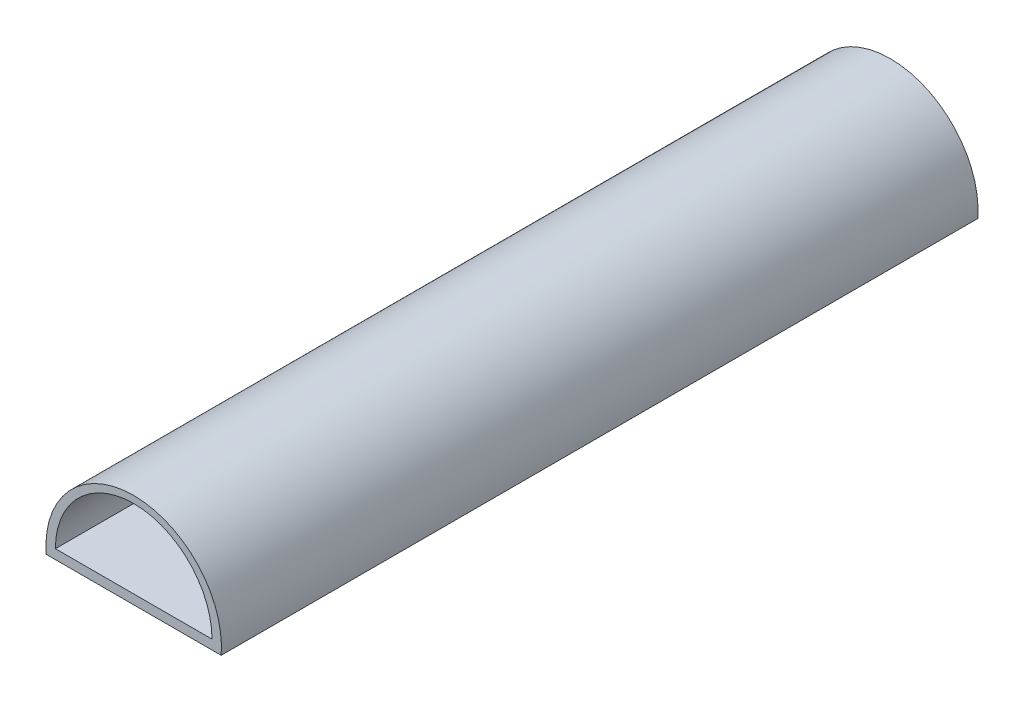
ISO-10303-21;
HEADER;
FILE_DESCRIPTION(('STEP AP214'),'2;1');
FILE_NAME('part.step','',(''),(''),'','','');
FILE_SCHEMA(('AUTOMOTIVE_DESIGN { 1 0 10303 214 1 1 1 1 }'));
ENDSEC;
DATA;
#1=APPLICATION_CONTEXT('core data for automotive mechanical design processes');
#2=APPLICATION_PROTOCOL_DEFINITION('international standard','automotive_design',2000,#1);
#3=PRODUCT_CONTEXT('',#1,'mechanical');
#4=PRODUCT('Part','Part','',(#3));
#5=PRODUCT_RELATED_PRODUCT_CATEGORY('part','',(#4));
#6=PRODUCT_DEFINITION_FORMATION('','',#4);
#7=PRODUCT_DEFINITION_CONTEXT('part definition',#1,'design');
#8=PRODUCT_DEFINITION('design','',#6,#7);
#9=PRODUCT_DEFINITION_SHAPE('','',#8);
#10=(LENGTH_UNIT() NAMED_UNIT(*) SI_UNIT(.MILLI.,.METRE.));
#11=(NAMED_UNIT(*) PLANE_ANGLE_UNIT() SI_UNIT($,.RADIAN.));
#12=(NAMED_UNIT(*) SI_UNIT($,.STERADIAN.) SOLID_ANGLE_UNIT());
#13=UNCERTAINTY_MEASURE_WITH_UNIT(LENGTH_MEASURE(1.E-05),#10,'distance_accuracy_value','');
#14=(GEOMETRIC_REPRESENTATION_CONTEXT(3) GLOBAL_UNCERTAINTY_ASSIGNED_CONTEXT((#13)) GLOBAL_UNIT_ASSIGNED_CONTEXT((#10,
#11,#12)) REPRESENTATION_CONTEXT('',''));
#15=CARTESIAN_POINT('',(0.,0.,0.));
#16=DIRECTION('',(0.,0.,1.));
#17=DIRECTION('',(1.,0.,0.));
#18=AXIS2_PLACEMENT_3D('',#15,#16,#17);
#19=CARTESIAN_POINT('',(-8.42700279293845,-8.87685553456328,127.));
#20=DIRECTION('',(0.,0.,-1.));
#21=DIRECTION('',(-1.,0.,0.));
#22=AXIS2_PLACEMENT_3D('',#19,#20,#21);
#23=PLANE('',#22);
#24=CARTESIAN_POINT('',(-8.42700279293845,-8.87685553456328,127.));
#25=DIRECTION('',(0.,0.,1.));
#26=DIRECTION('',(-1.,0.,0.));
#27=AXIS2_PLACEMENT_3D('',#24,#25,#26);
#28=CIRCLE('',#27,14.7310367744908);
#29=CARTESIAN_POINT('',(6.25737220706155,-10.0484251273645,127.));
#30=VERTEX_POINT('',#29);
#31=CARTESIAN_POINT('',(-23.1113777929385,-10.0484251273645,127.));
#32=VERTEX_POINT('',#31);
#33=EDGE_CURVE('E103',#30,#32,#28,.T.);
#34=ORIENTED_EDGE('',*,*,#33,.T.);
#35=DIRECTION('',(1.,0.,0.));
#36=VECTOR('',#35,1.);
#37=CARTESIAN_POINT('',(-23.1113777929385,-10.0484251273645,127.));
#38=LINE('',#37,#36);
#39=EDGE_CURVE('E107',#32,#30,#38,.T.);
#40=ORIENTED_EDGE('',*,*,#39,.T.);
#41=EDGE_LOOP('',(#34,#40));
#42=FACE_BOUND('',#41,.T.);
#43=CARTESIAN_POINT('',(-8.42700279293845,-8.46092512736455,127.));
#44=DIRECTION('',(0.,0.,1.));
#45=DIRECTION('',(-1.,0.,0.));
#46=AXIS2_PLACEMENT_3D('',#43,#44,#45);
#47=CIRCLE('',#46,13.1445);
#48=CARTESIAN_POINT('',(4.71749720706154,-8.46092512736455,127.));
#49=VERTEX_POINT('',#48);
#50=CARTESIAN_POINT('',(-21.5715027929384,-8.46092512736455,127.));
#51=VERTEX_POINT('',#50);
#52=EDGE_CURVE('E83',#49,#51,#47,.T.);
#53=ORIENTED_EDGE('',*,*,#52,.F.);
#54=DIRECTION('',(1.,0.,0.));
#55=VECTOR('',#54,1.);
#56=CARTESIAN_POINT('',(-8.42700279293845,-8.46092512736455,127.));
#57=LINE('',#56,#55);
#58=EDGE_CURVE('E78',#51,#49,#57,.T.);
#59=ORIENTED_EDGE('',*,*,#58,.F.);
#60=EDGE_LOOP('',(#53,#59));
#61=FACE_BOUND('',#60,.T.);
#62=ADVANCED_FACE('F39',(#42,#61),#23,.F.);
#63=CARTESIAN_POINT('',(-8.42700279293845,-8.87685553456328,0.));
#64=DIRECTION('',(0.,0.,-1.));
#65=DIRECTION('',(-1.,0.,0.));
#66=AXIS2_PLACEMENT_3D('',#63,#64,#65);
#67=PLANE('',#66);
#68=CARTESIAN_POINT('',(-8.42700279293845,-8.87685553456328,0.));
#69=DIRECTION('',(0.,0.,1.));
#70=DIRECTION('',(-1.,0.,0.));
#71=AXIS2_PLACEMENT_3D('',#68,#69,#70);
#72=CIRCLE('',#71,14.7310367744908);
#73=CARTESIAN_POINT('',(6.25737220706155,-10.0484251273645,0.));
#74=VERTEX_POINT('',#73);
#75=CARTESIAN_POINT('',(-23.1113777929385,-10.0484251273645,0.));
#76=VERTEX_POINT('',#75);
#77=EDGE_CURVE('E92',#74,#76,#72,.T.);
#78=ORIENTED_EDGE('',*,*,#77,.F.);
#79=DIRECTION('',(1.,0.,0.));
#80=VECTOR('',#79,1.);
#81=CARTESIAN_POINT('',(-23.1113777929385,-10.0484251273645,0.));
#82=LINE('',#81,#80);
#83=EDGE_CURVE('E108',#76,#74,#82,.T.);
#84=ORIENTED_EDGE('',*,*,#83,.F.);
#85=EDGE_LOOP('',(#78,#84));
#86=FACE_BOUND('',#85,.T.);
#87=DIRECTION('',(1.,0.,0.));
#88=VECTOR('',#87,1.);
#89=CARTESIAN_POINT('',(-8.42700279293845,-8.46092512736455,0.));
#90=LINE('',#89,#88);
#91=CARTESIAN_POINT('',(-21.5715027929384,-8.46092512736455,0.));
#92=VERTEX_POINT('',#91);
#93=CARTESIAN_POINT('',(4.71749720706154,-8.46092512736455,0.));
#94=VERTEX_POINT('',#93);
#95=EDGE_CURVE('E84',#92,#94,#90,.T.);
#96=ORIENTED_EDGE('',*,*,#95,.T.);
#97=CARTESIAN_POINT('',(-8.42700279293845,-8.46092512736455,0.));
#98=DIRECTION('',(0.,0.,1.));
#99=DIRECTION('',(-1.,0.,0.));
#100=AXIS2_PLACEMENT_3D('',#97,#98,#99);
#101=CIRCLE('',#100,13.1445);
#102=EDGE_CURVE('E89',#94,#92,#101,.T.);
#103=ORIENTED_EDGE('',*,*,#102,.T.);
#104=EDGE_LOOP('',(#96,#103));
#105=FACE_BOUND('',#104,.T.);
#106=ADVANCED_FACE('F124',(#86,#105),#67,.T.);
#107=CARTESIAN_POINT('',(-8.42700279293845,-8.87685553456328,127.));
#108=DIRECTION('',(0.,0.,-1.));
#109=DIRECTION('',(-1.,0.,0.));
#110=AXIS2_PLACEMENT_3D('',#107,#108,#109);
#111=CYLINDRICAL_SURFACE('',#110,14.7310367744908);
#112=ORIENTED_EDGE('',*,*,#77,.T.);
#113=DIRECTION('',(0.,0.,-1.));
#114=VECTOR('',#113,1.);
#115=CARTESIAN_POINT('',(-23.1113777929385,-10.0484251273645,127.));
#116=LINE('',#115,#114);
#117=EDGE_CURVE('E11',#32,#76,#116,.T.);
#118=ORIENTED_EDGE('',*,*,#117,.F.);
#119=ORIENTED_EDGE('',*,*,#33,.F.);
#120=DIRECTION('',(0.,0.,-1.));
#121=VECTOR('',#120,1.);
#122=CARTESIAN_POINT('',(6.25737220706155,-10.0484251273645,127.));
#123=LINE('',#122,#121);
#124=EDGE_CURVE('E48',#30,#74,#123,.T.);
#125=ORIENTED_EDGE('',*,*,#124,.T.);
#126=EDGE_LOOP('',(#112,#118,#119,#125));
#127=FACE_BOUND('',#126,.T.);
#128=ADVANCED_FACE('F41',(#127),#111,.T.);
#129=CARTESIAN_POINT('',(-23.1113777929385,-10.0484251273645,127.));
#130=DIRECTION('',(0.,1.,0.));
#131=DIRECTION('',(0.,0.,1.));
#132=AXIS2_PLACEMENT_3D('',#129,#130,#131);
#133=PLANE('',#132);
#134=ORIENTED_EDGE('',*,*,#83,.T.);
#135=ORIENTED_EDGE('',*,*,#124,.F.);
#136=ORIENTED_EDGE('',*,*,#39,.F.);
#137=ORIENTED_EDGE('',*,*,#117,.T.);
#138=EDGE_LOOP('',(#134,#135,#136,#137));
#139=FACE_BOUND('',#138,.T.);
#140=ADVANCED_FACE('F126',(#139),#133,.F.);
#141=CARTESIAN_POINT('',(-8.42700279293845,-8.46092512736455,127.));
#142=DIRECTION('',(0.,0.,-1.));
#143=DIRECTION('',(-1.,0.,0.));
#144=AXIS2_PLACEMENT_3D('',#141,#142,#143);
#145=CYLINDRICAL_SURFACE('',#144,13.1445);
#146=ORIENTED_EDGE('',*,*,#102,.F.);
#147=DIRECTION('',(0.,0.,-1.));
#148=VECTOR('',#147,1.);
#149=CARTESIAN_POINT('',(4.71749720706154,-8.46092512736455,127.));
#150=LINE('',#149,#148);
#151=EDGE_CURVE('E60',#49,#94,#150,.T.);
#152=ORIENTED_EDGE('',*,*,#151,.F.);
#153=ORIENTED_EDGE('',*,*,#52,.T.);
#154=DIRECTION('',(0.,0.,-1.));
#155=VECTOR('',#154,1.);
#156=CARTESIAN_POINT('',(-21.5715027929384,-8.46092512736455,127.));
#157=LINE('',#156,#155);
#158=EDGE_CURVE('E55',#51,#92,#157,.T.);
#159=ORIENTED_EDGE('',*,*,#158,.T.);
#160=EDGE_LOOP('',(#146,#152,#153,#159));
#161=FACE_BOUND('',#160,.T.);
#162=ADVANCED_FACE('F87',(#161),#145,.F.);
#163=CARTESIAN_POINT('',(-8.42700279293845,-8.46092512736455,127.));
#164=DIRECTION('',(0.,1.,0.));
#165=DIRECTION('',(-1.,0.,0.));
#166=AXIS2_PLACEMENT_3D('',#163,#164,#165);
#167=PLANE('',#166);
#168=ORIENTED_EDGE('',*,*,#95,.F.);
#169=ORIENTED_EDGE('',*,*,#158,.F.);
#170=ORIENTED_EDGE('',*,*,#58,.T.);
#171=ORIENTED_EDGE('',*,*,#151,.T.);
#172=EDGE_LOOP('',(#168,#169,#170,#171));
#173=FACE_BOUND('',#172,.T.);
#174=ADVANCED_FACE('F79',(#173),#167,.T.);
#175=CLOSED_SHELL('',(#62,#106,#128,#140,#162,#174));
#176=MANIFOLD_SOLID_BREP('B2',#175);
#177=ADVANCED_BREP_SHAPE_REPRESENTATION('',(#18,#176),#14);
#178=SHAPE_DEFINITION_REPRESENTATION(#9,#177);
ENDSEC;
END-ISO-10303-21;
